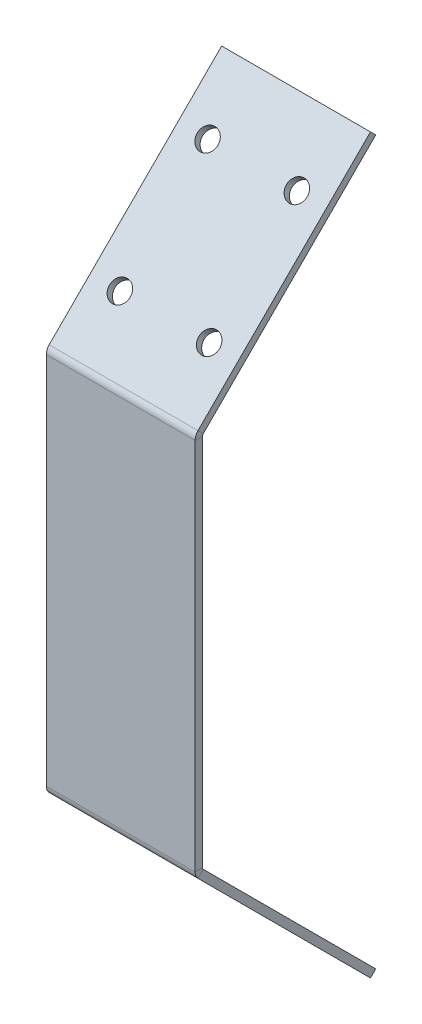
ISO-10303-21;
HEADER;
FILE_DESCRIPTION(('STEP AP214'),'2;1');
FILE_NAME('part.step','',(''),(''),'','','');
FILE_SCHEMA(('AUTOMOTIVE_DESIGN { 1 0 10303 214 1 1 1 1 }'));
ENDSEC;
DATA;
#1=APPLICATION_CONTEXT('core data for automotive mechanical design processes');
#2=APPLICATION_PROTOCOL_DEFINITION('international standard','automotive_design',2000,#1);
#3=PRODUCT_CONTEXT('',#1,'mechanical');
#4=PRODUCT('Part','Part','',(#3));
#5=PRODUCT_RELATED_PRODUCT_CATEGORY('part','',(#4));
#6=PRODUCT_DEFINITION_FORMATION('','',#4);
#7=PRODUCT_DEFINITION_CONTEXT('part definition',#1,'design');
#8=PRODUCT_DEFINITION('design','',#6,#7);
#9=PRODUCT_DEFINITION_SHAPE('','',#8);
#10=(LENGTH_UNIT() NAMED_UNIT(*) SI_UNIT(.MILLI.,.METRE.));
#11=(NAMED_UNIT(*) PLANE_ANGLE_UNIT() SI_UNIT($,.RADIAN.));
#12=(NAMED_UNIT(*) SI_UNIT($,.STERADIAN.) SOLID_ANGLE_UNIT());
#13=UNCERTAINTY_MEASURE_WITH_UNIT(LENGTH_MEASURE(1.E-05),#10,'distance_accuracy_value','');
#14=(GEOMETRIC_REPRESENTATION_CONTEXT(3) GLOBAL_UNCERTAINTY_ASSIGNED_CONTEXT((#13)) GLOBAL_UNIT_ASSIGNED_CONTEXT((#10,
#11,#12)) REPRESENTATION_CONTEXT('',''));
#15=CARTESIAN_POINT('',(0.,0.,0.));
#16=DIRECTION('',(0.,0.,1.));
#17=DIRECTION('',(1.,0.,0.));
#18=AXIS2_PLACEMENT_3D('',#15,#16,#17);
#19=CARTESIAN_POINT('',(0.,0.,-3.));
#20=DIRECTION('',(0.,0.,1.));
#21=DIRECTION('',(1.,0.,0.));
#22=AXIS2_PLACEMENT_3D('',#19,#20,#21);
#23=PLANE('',#22);
#24=DIRECTION('',(-1.,0.,0.));
#25=VECTOR('',#24,1.);
#26=CARTESIAN_POINT('',(-30.,-75.3431457505076,-2.99999999999998));
#27=LINE('',#26,#25);
#28=CARTESIAN_POINT('',(-30.,-75.3431457505076,-2.99999999999998));
#29=VERTEX_POINT('',#28);
#30=CARTESIAN_POINT('',(30.,-75.3431457505076,-2.99999999999998));
#31=VERTEX_POINT('',#30);
#32=EDGE_CURVE('E278',#29,#31,#27,.F.);
#33=ORIENTED_EDGE('',*,*,#32,.F.);
#34=DIRECTION('',(0.,-1.,0.));
#35=VECTOR('',#34,1.);
#36=CARTESIAN_POINT('',(-30.,80.,-3.));
#37=LINE('',#36,#35);
#38=CARTESIAN_POINT('',(-30.,75.3431457505076,-2.99999999999999));
#39=VERTEX_POINT('',#38);
#40=EDGE_CURVE('E13',#39,#29,#37,.T.);
#41=ORIENTED_EDGE('',*,*,#40,.F.);
#42=DIRECTION('',(1.,0.,0.));
#43=VECTOR('',#42,1.);
#44=CARTESIAN_POINT('',(30.,75.3431457505076,-2.99999999999999));
#45=LINE('',#44,#43);
#46=CARTESIAN_POINT('',(30.,75.3431457505076,-2.99999999999999));
#47=VERTEX_POINT('',#46);
#48=EDGE_CURVE('E145',#47,#39,#45,.F.);
#49=ORIENTED_EDGE('',*,*,#48,.F.);
#50=DIRECTION('',(0.,1.,0.));
#51=VECTOR('',#50,1.);
#52=CARTESIAN_POINT('',(30.,80.,-3.));
#53=LINE('',#52,#51);
#54=EDGE_CURVE('E86',#31,#47,#53,.T.);
#55=ORIENTED_EDGE('',*,*,#54,.F.);
#56=EDGE_LOOP('',(#33,#41,#49,#55));
#57=FACE_BOUND('',#56,.T.);
#58=ADVANCED_FACE('F77',(#57),#23,.F.);
#59=CARTESIAN_POINT('',(0.,0.,0.));
#60=DIRECTION('',(0.,0.,1.));
#61=DIRECTION('',(1.,0.,0.));
#62=AXIS2_PLACEMENT_3D('',#59,#60,#61);
#63=PLANE('',#62);
#64=DIRECTION('',(0.,-1.,0.));
#65=VECTOR('',#64,1.);
#66=CARTESIAN_POINT('',(-30.,80.,0.));
#67=LINE('',#66,#65);
#68=CARTESIAN_POINT('',(-30.,75.3431457505076,0.));
#69=VERTEX_POINT('',#68);
#70=CARTESIAN_POINT('',(-30.,-75.3431457505076,0.));
#71=VERTEX_POINT('',#70);
#72=EDGE_CURVE('E182',#69,#71,#67,.T.);
#73=ORIENTED_EDGE('',*,*,#72,.T.);
#74=DIRECTION('',(-1.,0.,0.));
#75=VECTOR('',#74,1.);
#76=CARTESIAN_POINT('',(-30.,-75.3431457505076,0.));
#77=LINE('',#76,#75);
#78=CARTESIAN_POINT('',(30.,-75.3431457505076,0.));
#79=VERTEX_POINT('',#78);
#80=EDGE_CURVE('E266',#71,#79,#77,.F.);
#81=ORIENTED_EDGE('',*,*,#80,.T.);
#82=DIRECTION('',(0.,1.,0.));
#83=VECTOR('',#82,1.);
#84=CARTESIAN_POINT('',(30.,80.,0.));
#85=LINE('',#84,#83);
#86=CARTESIAN_POINT('',(30.,75.3431457505076,0.));
#87=VERTEX_POINT('',#86);
#88=EDGE_CURVE('E103',#79,#87,#85,.T.);
#89=ORIENTED_EDGE('',*,*,#88,.T.);
#90=DIRECTION('',(1.,0.,0.));
#91=VECTOR('',#90,1.);
#92=CARTESIAN_POINT('',(30.,75.3431457505076,0.));
#93=LINE('',#92,#91);
#94=EDGE_CURVE('E172',#87,#69,#93,.F.);
#95=ORIENTED_EDGE('',*,*,#94,.T.);
#96=EDGE_LOOP('',(#73,#81,#89,#95));
#97=FACE_BOUND('',#96,.T.);
#98=ADVANCED_FACE('F375',(#97),#63,.T.);
#99=CARTESIAN_POINT('',(-30.,80.,-3.));
#100=DIRECTION('',(-1.,0.,0.));
#101=DIRECTION('',(0.,-1.,0.));
#102=AXIS2_PLACEMENT_3D('',#99,#100,#101);
#103=PLANE('',#102);
#104=ORIENTED_EDGE('',*,*,#40,.T.);
#105=DIRECTION('',(0.,0.,1.));
#106=VECTOR('',#105,1.);
#107=CARTESIAN_POINT('',(-30.,-75.3431457505076,-2.99999999999998));
#108=LINE('',#107,#106);
#109=EDGE_CURVE('E272',#29,#71,#108,.T.);
#110=ORIENTED_EDGE('',*,*,#109,.T.);
#111=ORIENTED_EDGE('',*,*,#72,.F.);
#112=DIRECTION('',(0.,0.,1.));
#113=VECTOR('',#112,1.);
#114=CARTESIAN_POINT('',(-30.,75.3431457505076,-2.99999999999999));
#115=LINE('',#114,#113);
#116=EDGE_CURVE('E179',#39,#69,#115,.T.);
#117=ORIENTED_EDGE('',*,*,#116,.F.);
#118=EDGE_LOOP('',(#104,#110,#111,#117));
#119=FACE_BOUND('',#118,.T.);
#120=ADVANCED_FACE('F385',(#119),#103,.T.);
#121=CARTESIAN_POINT('',(30.,80.,-3.));
#122=DIRECTION('',(1.,0.,0.));
#123=DIRECTION('',(0.,1.,0.));
#124=AXIS2_PLACEMENT_3D('',#121,#122,#123);
#125=PLANE('',#124);
#126=DIRECTION('',(0.,0.,1.));
#127=VECTOR('',#126,1.);
#128=CARTESIAN_POINT('',(30.,-75.3431457505076,-2.99999999999998));
#129=LINE('',#128,#127);
#130=EDGE_CURVE('E171',#31,#79,#129,.T.);
#131=ORIENTED_EDGE('',*,*,#130,.F.);
#132=ORIENTED_EDGE('',*,*,#54,.T.);
#133=DIRECTION('',(0.,0.,1.));
#134=VECTOR('',#133,1.);
#135=CARTESIAN_POINT('',(30.,75.3431457505076,-2.99999999999999));
#136=LINE('',#135,#134);
#137=EDGE_CURVE('E144',#47,#87,#136,.T.);
#138=ORIENTED_EDGE('',*,*,#137,.T.);
#139=ORIENTED_EDGE('',*,*,#88,.F.);
#140=EDGE_LOOP('',(#131,#132,#138,#139));
#141=FACE_BOUND('',#140,.T.);
#142=ADVANCED_FACE('F79',(#141),#125,.T.);
#143=CARTESIAN_POINT('',(-30.,75.3431457505076,-3.99999999999998));
#144=DIRECTION('',(-1.,0.,0.));
#145=DIRECTION('',(0.,0.,1.));
#146=AXIS2_PLACEMENT_3D('',#143,#144,#145);
#147=PLANE('',#146);
#148=DIRECTION('',(0.,0.707106781186544,0.707106781186551));
#149=VECTOR('',#148,1.);
#150=CARTESIAN_POINT('',(-30.,78.1715728752538,-1.1715728752538));
#151=LINE('',#150,#149);
#152=CARTESIAN_POINT('',(-30.,76.0502525316941,-3.29289321881344));
#153=VERTEX_POINT('',#152);
#154=CARTESIAN_POINT('',(-30.,78.1715728752538,-1.17157287525379));
#155=VERTEX_POINT('',#154);
#156=EDGE_CURVE('E134',#153,#155,#151,.T.);
#157=ORIENTED_EDGE('',*,*,#156,.F.);
#158=CARTESIAN_POINT('',(-30.,75.3431457505076,-3.99999999999998));
#159=DIRECTION('',(1.,0.,0.));
#160=DIRECTION('',(0.,0.,-1.));
#161=AXIS2_PLACEMENT_3D('',#158,#159,#160);
#162=CIRCLE('',#161,0.999999999999996);
#163=EDGE_CURVE('E128',#39,#153,#162,.F.);
#164=ORIENTED_EDGE('',*,*,#163,.F.);
#165=ORIENTED_EDGE('',*,*,#116,.T.);
#166=CARTESIAN_POINT('',(-30.,75.3431457505076,-3.99999999999998));
#167=DIRECTION('',(1.,0.,0.));
#168=DIRECTION('',(0.,0.,-1.));
#169=AXIS2_PLACEMENT_3D('',#166,#167,#168);
#170=CIRCLE('',#169,4.);
#171=EDGE_CURVE('E94',#69,#155,#170,.F.);
#172=ORIENTED_EDGE('',*,*,#171,.T.);
#173=EDGE_LOOP('',(#157,#164,#165,#172));
#174=FACE_BOUND('',#173,.T.);
#175=ADVANCED_FACE('F383',(#174),#147,.T.);
#176=CARTESIAN_POINT('',(30.,75.3431457505076,-3.99999999999998));
#177=DIRECTION('',(-1.,0.,0.));
#178=DIRECTION('',(0.,0.,1.));
#179=AXIS2_PLACEMENT_3D('',#176,#177,#178);
#180=PLANE('',#179);
#181=CARTESIAN_POINT('',(30.,75.3431457505076,-3.99999999999998));
#182=DIRECTION('',(1.,0.,0.));
#183=DIRECTION('',(0.,0.,-1.));
#184=AXIS2_PLACEMENT_3D('',#181,#182,#183);
#185=CIRCLE('',#184,0.999999999999996);
#186=CARTESIAN_POINT('',(30.,76.0502525316941,-3.29289321881344));
#187=VERTEX_POINT('',#186);
#188=EDGE_CURVE('E125',#187,#47,#185,.T.);
#189=ORIENTED_EDGE('',*,*,#188,.F.);
#190=DIRECTION('',(0.,0.707106781186544,0.707106781186551));
#191=VECTOR('',#190,1.);
#192=CARTESIAN_POINT('',(30.,76.0502525316941,-3.29289321881344));
#193=LINE('',#192,#191);
#194=CARTESIAN_POINT('',(30.,78.1715728752538,-1.17157287525378));
#195=VERTEX_POINT('',#194);
#196=EDGE_CURVE('E133',#187,#195,#193,.T.);
#197=ORIENTED_EDGE('',*,*,#196,.T.);
#198=CARTESIAN_POINT('',(30.,75.3431457505076,-3.99999999999998));
#199=DIRECTION('',(1.,0.,0.));
#200=DIRECTION('',(0.,0.,-1.));
#201=AXIS2_PLACEMENT_3D('',#198,#199,#200);
#202=CIRCLE('',#201,4.);
#203=EDGE_CURVE('E174',#195,#87,#202,.T.);
#204=ORIENTED_EDGE('',*,*,#203,.T.);
#205=ORIENTED_EDGE('',*,*,#137,.F.);
#206=EDGE_LOOP('',(#189,#197,#204,#205));
#207=FACE_BOUND('',#206,.T.);
#208=ADVANCED_FACE('F139',(#207),#180,.F.);
#209=CARTESIAN_POINT('',(30.,75.3431457505076,-3.99999999999998));
#210=DIRECTION('',(1.,0.,0.));
#211=DIRECTION('',(0.,0.707106781186544,0.707106781186551));
#212=AXIS2_PLACEMENT_3D('',#209,#210,#211);
#213=CYLINDRICAL_SURFACE('',#212,4.);
#214=ORIENTED_EDGE('',*,*,#94,.F.);
#215=ORIENTED_EDGE('',*,*,#203,.F.);
#216=DIRECTION('',(1.,0.,0.));
#217=VECTOR('',#216,1.);
#218=CARTESIAN_POINT('',(0.,78.1715728752538,-1.17157287525377));
#219=LINE('',#218,#217);
#220=EDGE_CURVE('E163',#155,#195,#219,.T.);
#221=ORIENTED_EDGE('',*,*,#220,.F.);
#222=ORIENTED_EDGE('',*,*,#171,.F.);
#223=EDGE_LOOP('',(#214,#215,#221,#222));
#224=FACE_BOUND('',#223,.T.);
#225=ADVANCED_FACE('F399',(#224),#213,.T.);
#226=CARTESIAN_POINT('',(30.,75.3431457505076,-3.99999999999998));
#227=DIRECTION('',(1.,0.,0.));
#228=DIRECTION('',(0.,0.707106781186544,0.707106781186551));
#229=AXIS2_PLACEMENT_3D('',#226,#227,#228);
#230=CYLINDRICAL_SURFACE('',#229,0.999999999999996);
#231=ORIENTED_EDGE('',*,*,#48,.T.);
#232=ORIENTED_EDGE('',*,*,#163,.T.);
#233=DIRECTION('',(-1.,0.,0.));
#234=VECTOR('',#233,1.);
#235=CARTESIAN_POINT('',(-30.,76.0502525316941,-3.29289321881344));
#236=LINE('',#235,#234);
#237=EDGE_CURVE('E122',#153,#187,#236,.F.);
#238=ORIENTED_EDGE('',*,*,#237,.T.);
#239=ORIENTED_EDGE('',*,*,#188,.T.);
#240=EDGE_LOOP('',(#231,#232,#238,#239));
#241=FACE_BOUND('',#240,.T.);
#242=ADVANCED_FACE('F124',(#241),#230,.F.);
#243=CARTESIAN_POINT('',(30.,77.8786796564403,-0.878679656440342));
#244=DIRECTION('',(1.,0.,0.));
#245=DIRECTION('',(0.,1.,0.));
#246=AXIS2_PLACEMENT_3D('',#243,#244,#245);
#247=PLANE('',#246);
#248=DIRECTION('',(0.,-0.707106781186551,0.707106781186544));
#249=VECTOR('',#248,1.);
#250=CARTESIAN_POINT('',(30.,77.8786796564403,-0.878679656440342));
#251=LINE('',#250,#249);
#252=CARTESIAN_POINT('',(30.,147.710678118655,-70.7106781186544));
#253=VERTEX_POINT('',#252);
#254=EDGE_CURVE('E162',#253,#195,#251,.T.);
#255=ORIENTED_EDGE('',*,*,#254,.T.);
#256=ORIENTED_EDGE('',*,*,#196,.F.);
#257=DIRECTION('',(0.,0.707106781186551,-0.707106781186544));
#258=VECTOR('',#257,1.);
#259=CARTESIAN_POINT('',(30.,34.2573593128803,38.5));
#260=LINE('',#259,#258);
#261=CARTESIAN_POINT('',(30.,145.589357775095,-72.8319984622141));
#262=VERTEX_POINT('',#261);
#263=EDGE_CURVE('E150',#262,#187,#260,.F.);
#264=ORIENTED_EDGE('',*,*,#263,.F.);
#265=DIRECTION('',(0.,-0.707106781186544,-0.707106781186551));
#266=VECTOR('',#265,1.);
#267=CARTESIAN_POINT('',(30.,147.710678118655,-70.7106781186544));
#268=LINE('',#267,#266);
#269=EDGE_CURVE('E146',#253,#262,#268,.T.);
#270=ORIENTED_EDGE('',*,*,#269,.F.);
#271=EDGE_LOOP('',(#255,#256,#264,#270));
#272=FACE_BOUND('',#271,.T.);
#273=ADVANCED_FACE('F160',(#272),#247,.T.);
#274=CARTESIAN_POINT('',(-30.,147.710678118655,-70.7106781186544));
#275=DIRECTION('',(-1.,0.,0.));
#276=DIRECTION('',(0.,-1.,0.));
#277=AXIS2_PLACEMENT_3D('',#274,#275,#276);
#278=PLANE('',#277);
#279=DIRECTION('',(0.,-0.707106781186551,0.707106781186544));
#280=VECTOR('',#279,1.);
#281=CARTESIAN_POINT('',(-30.,34.2573593128803,38.5));
#282=LINE('',#281,#280);
#283=CARTESIAN_POINT('',(-30.,145.589357775095,-72.8319984622141));
#284=VERTEX_POINT('',#283);
#285=EDGE_CURVE('E165',#153,#284,#282,.F.);
#286=ORIENTED_EDGE('',*,*,#285,.F.);
#287=ORIENTED_EDGE('',*,*,#156,.T.);
#288=DIRECTION('',(0.,0.707106781186551,-0.707106781186544));
#289=VECTOR('',#288,1.);
#290=CARTESIAN_POINT('',(-30.,147.710678118655,-70.7106781186544));
#291=LINE('',#290,#289);
#292=CARTESIAN_POINT('',(-30.,147.710678118655,-70.7106781186544));
#293=VERTEX_POINT('',#292);
#294=EDGE_CURVE('E157',#155,#293,#291,.T.);
#295=ORIENTED_EDGE('',*,*,#294,.T.);
#296=DIRECTION('',(0.,-0.707106781186544,-0.707106781186551));
#297=VECTOR('',#296,1.);
#298=CARTESIAN_POINT('',(-30.,147.710678118655,-70.7106781186544));
#299=LINE('',#298,#297);
#300=EDGE_CURVE('E289',#293,#284,#299,.T.);
#301=ORIENTED_EDGE('',*,*,#300,.T.);
#302=EDGE_LOOP('',(#286,#287,#295,#301));
#303=FACE_BOUND('',#302,.T.);
#304=ADVANCED_FACE('F302',(#303),#278,.T.);
#305=CARTESIAN_POINT('',(0.,36.3786796564399,40.6213203435596));
#306=DIRECTION('',(0.,0.707106781186544,0.707106781186551));
#307=DIRECTION('',(0.,-0.707106781186551,0.707106781186544));
#308=AXIS2_PLACEMENT_3D('',#305,#306,#307);
#309=PLANE('',#308);
#310=CARTESIAN_POINT('',(-18.,94.6776695296638,-17.6776695296636));
#311=DIRECTION('',(0.,0.707106781186544,0.707106781186551));
#312=DIRECTION('',(0.,-0.707106781186551,0.707106781186544));
#313=AXIS2_PLACEMENT_3D('',#310,#311,#312);
#314=CIRCLE('',#313,4.19999999999999);
#315=CARTESIAN_POINT('',(-18.,91.7078210486803,-14.7078210486801));
#316=VERTEX_POINT('',#315);
#317=EDGE_CURVE('E485',#316,#316,#314,.T.);
#318=ORIENTED_EDGE('',*,*,#317,.F.);
#319=EDGE_LOOP('',(#318));
#320=FACE_BOUND('',#319,.T.);
#321=CARTESIAN_POINT('',(18.,94.6776695296638,-17.6776695296636));
#322=DIRECTION('',(0.,0.707106781186544,0.707106781186551));
#323=DIRECTION('',(0.,-0.707106781186551,0.707106781186544));
#324=AXIS2_PLACEMENT_3D('',#321,#322,#323);
#325=CIRCLE('',#324,4.19999999999999);
#326=CARTESIAN_POINT('',(18.,91.7078210486803,-14.7078210486801));
#327=VERTEX_POINT('',#326);
#328=EDGE_CURVE('E481',#327,#327,#325,.T.);
#329=ORIENTED_EDGE('',*,*,#328,.F.);
#330=EDGE_LOOP('',(#329));
#331=FACE_BOUND('',#330,.T.);
#332=CARTESIAN_POINT('',(18.,130.033008588991,-53.0330085889908));
#333=DIRECTION('',(0.,0.707106781186544,0.707106781186551));
#334=DIRECTION('',(0.,-0.707106781186551,0.707106781186544));
#335=AXIS2_PLACEMENT_3D('',#332,#333,#334);
#336=CIRCLE('',#335,4.2);
#337=CARTESIAN_POINT('',(18.,127.063160108008,-50.0631601080073));
#338=VERTEX_POINT('',#337);
#339=EDGE_CURVE('E474',#338,#338,#336,.T.);
#340=ORIENTED_EDGE('',*,*,#339,.F.);
#341=EDGE_LOOP('',(#340));
#342=FACE_BOUND('',#341,.T.);
#343=CARTESIAN_POINT('',(-18.,130.033008588991,-53.0330085889908));
#344=DIRECTION('',(0.,0.707106781186544,0.707106781186551));
#345=DIRECTION('',(0.,-0.707106781186551,0.707106781186544));
#346=AXIS2_PLACEMENT_3D('',#343,#344,#345);
#347=CIRCLE('',#346,4.20000000000001);
#348=CARTESIAN_POINT('',(-18.,127.063160108008,-50.0631601080073));
#349=VERTEX_POINT('',#348);
#350=EDGE_CURVE('E205',#349,#349,#347,.T.);
#351=ORIENTED_EDGE('',*,*,#350,.F.);
#352=EDGE_LOOP('',(#351));
#353=FACE_BOUND('',#352,.T.);
#354=ORIENTED_EDGE('',*,*,#294,.F.);
#355=ORIENTED_EDGE('',*,*,#220,.T.);
#356=ORIENTED_EDGE('',*,*,#254,.F.);
#357=DIRECTION('',(1.,0.,0.));
#358=VECTOR('',#357,1.);
#359=CARTESIAN_POINT('',(30.,147.710678118655,-70.7106781186544));
#360=LINE('',#359,#358);
#361=EDGE_CURVE('E293',#293,#253,#360,.T.);
#362=ORIENTED_EDGE('',*,*,#361,.F.);
#363=EDGE_LOOP('',(#354,#355,#356,#362));
#364=FACE_BOUND('',#363,.T.);
#365=ADVANCED_FACE('F408',(#320,#331,#342,#353,#364),#309,.T.);
#366=CARTESIAN_POINT('',(0.,34.2573593128803,38.5));
#367=DIRECTION('',(0.,0.707106781186544,0.707106781186551));
#368=DIRECTION('',(0.,-0.707106781186551,0.707106781186544));
#369=AXIS2_PLACEMENT_3D('',#366,#367,#368);
#370=PLANE('',#369);
#371=CARTESIAN_POINT('',(-18.,92.5563491861041,-19.7989898732233));
#372=DIRECTION('',(0.,0.707106781186544,0.707106781186551));
#373=DIRECTION('',(0.,-0.707106781186551,0.707106781186544));
#374=AXIS2_PLACEMENT_3D('',#371,#372,#373);
#375=CIRCLE('',#374,4.19999999999999);
#376=CARTESIAN_POINT('',(-18.,89.5865007051206,-16.8291413922398));
#377=VERTEX_POINT('',#376);
#378=EDGE_CURVE('E81',#377,#377,#375,.T.);
#379=ORIENTED_EDGE('',*,*,#378,.T.);
#380=EDGE_LOOP('',(#379));
#381=FACE_BOUND('',#380,.T.);
#382=CARTESIAN_POINT('',(18.,92.5563491861041,-19.7989898732233));
#383=DIRECTION('',(0.,0.707106781186544,0.707106781186551));
#384=DIRECTION('',(0.,-0.707106781186551,0.707106781186544));
#385=AXIS2_PLACEMENT_3D('',#382,#383,#384);
#386=CIRCLE('',#385,4.19999999999999);
#387=CARTESIAN_POINT('',(18.,89.5865007051206,-16.8291413922398));
#388=VERTEX_POINT('',#387);
#389=EDGE_CURVE('E207',#388,#388,#386,.T.);
#390=ORIENTED_EDGE('',*,*,#389,.T.);
#391=EDGE_LOOP('',(#390));
#392=FACE_BOUND('',#391,.T.);
#393=CARTESIAN_POINT('',(18.,127.911688245432,-55.1543289325505));
#394=DIRECTION('',(0.,0.707106781186544,0.707106781186551));
#395=DIRECTION('',(0.,-0.707106781186551,0.707106781186544));
#396=AXIS2_PLACEMENT_3D('',#393,#394,#395);
#397=CIRCLE('',#396,4.2);
#398=CARTESIAN_POINT('',(18.,124.941839764448,-52.184480451567));
#399=VERTEX_POINT('',#398);
#400=EDGE_CURVE('E204',#399,#399,#397,.T.);
#401=ORIENTED_EDGE('',*,*,#400,.T.);
#402=EDGE_LOOP('',(#401));
#403=FACE_BOUND('',#402,.T.);
#404=CARTESIAN_POINT('',(-18.,127.911688245432,-55.1543289325505));
#405=DIRECTION('',(0.,0.707106781186544,0.707106781186551));
#406=DIRECTION('',(0.,-0.707106781186551,0.707106781186544));
#407=AXIS2_PLACEMENT_3D('',#404,#405,#406);
#408=CIRCLE('',#407,4.20000000000001);
#409=CARTESIAN_POINT('',(-18.,124.941839764448,-52.184480451567));
#410=VERTEX_POINT('',#409);
#411=EDGE_CURVE('E201',#410,#410,#408,.T.);
#412=ORIENTED_EDGE('',*,*,#411,.T.);
#413=EDGE_LOOP('',(#412));
#414=FACE_BOUND('',#413,.T.);
#415=ORIENTED_EDGE('',*,*,#237,.F.);
#416=ORIENTED_EDGE('',*,*,#285,.T.);
#417=DIRECTION('',(-1.,0.,0.));
#418=VECTOR('',#417,1.);
#419=CARTESIAN_POINT('',(0.,145.589357775095,-72.8319984622141));
#420=LINE('',#419,#418);
#421=EDGE_CURVE('E154',#284,#262,#420,.F.);
#422=ORIENTED_EDGE('',*,*,#421,.T.);
#423=ORIENTED_EDGE('',*,*,#263,.T.);
#424=EDGE_LOOP('',(#415,#416,#422,#423));
#425=FACE_BOUND('',#424,.T.);
#426=ADVANCED_FACE('F151',(#381,#392,#403,#414,#425),#370,.F.);
#427=CARTESIAN_POINT('',(30.,147.710678118655,-70.7106781186544));
#428=DIRECTION('',(0.,0.707106781186551,-0.707106781186544));
#429=DIRECTION('',(0.,0.707106781186544,0.707106781186551));
#430=AXIS2_PLACEMENT_3D('',#427,#428,#429);
#431=PLANE('',#430);
#432=ORIENTED_EDGE('',*,*,#421,.F.);
#433=ORIENTED_EDGE('',*,*,#300,.F.);
#434=ORIENTED_EDGE('',*,*,#361,.T.);
#435=ORIENTED_EDGE('',*,*,#269,.T.);
#436=EDGE_LOOP('',(#432,#433,#434,#435));
#437=FACE_BOUND('',#436,.T.);
#438=ADVANCED_FACE('F307',(#437),#431,.T.);
#439=CARTESIAN_POINT('',(30.,-75.3431457505076,-4.));
#440=DIRECTION('',(1.,0.,0.));
#441=DIRECTION('',(0.,0.,-1.));
#442=AXIS2_PLACEMENT_3D('',#439,#440,#441);
#443=PLANE('',#442);
#444=DIRECTION('',(0.,0.707106781186544,-0.707106781186551));
#445=VECTOR('',#444,1.);
#446=CARTESIAN_POINT('',(30.,-78.1715728752538,-1.17157287525379));
#447=LINE('',#446,#445);
#448=CARTESIAN_POINT('',(30.,-76.0502525316942,-3.29289321881344));
#449=VERTEX_POINT('',#448);
#450=CARTESIAN_POINT('',(30.,-78.1715728752538,-1.17157287525379));
#451=VERTEX_POINT('',#450);
#452=EDGE_CURVE('E200',#449,#451,#447,.F.);
#453=ORIENTED_EDGE('',*,*,#452,.F.);
#454=CARTESIAN_POINT('',(30.,-75.3431457505076,-4.));
#455=DIRECTION('',(-1.,0.,0.));
#456=DIRECTION('',(0.,0.,1.));
#457=AXIS2_PLACEMENT_3D('',#454,#455,#456);
#458=CIRCLE('',#457,1.00000000000001);
#459=EDGE_CURVE('E275',#31,#449,#458,.F.);
#460=ORIENTED_EDGE('',*,*,#459,.F.);
#461=ORIENTED_EDGE('',*,*,#130,.T.);
#462=CARTESIAN_POINT('',(30.,-75.3431457505076,-4.));
#463=DIRECTION('',(-1.,0.,0.));
#464=DIRECTION('',(0.,0.,1.));
#465=AXIS2_PLACEMENT_3D('',#462,#463,#464);
#466=CIRCLE('',#465,4.00000000000001);
#467=EDGE_CURVE('E268',#79,#451,#466,.F.);
#468=ORIENTED_EDGE('',*,*,#467,.T.);
#469=EDGE_LOOP('',(#453,#460,#461,#468));
#470=FACE_BOUND('',#469,.T.);
#471=ADVANCED_FACE('F358',(#470),#443,.T.);
#472=CARTESIAN_POINT('',(-30.,-75.3431457505076,-4.));
#473=DIRECTION('',(1.,0.,0.));
#474=DIRECTION('',(0.,0.,-1.));
#475=AXIS2_PLACEMENT_3D('',#472,#473,#474);
#476=PLANE('',#475);
#477=CARTESIAN_POINT('',(-30.,-75.3431457505076,-4.));
#478=DIRECTION('',(-1.,0.,0.));
#479=DIRECTION('',(0.,0.,1.));
#480=AXIS2_PLACEMENT_3D('',#477,#478,#479);
#481=CIRCLE('',#480,1.00000000000001);
#482=CARTESIAN_POINT('',(-30.,-76.0502525316942,-3.29289321881344));
#483=VERTEX_POINT('',#482);
#484=EDGE_CURVE('E233',#483,#29,#481,.T.);
#485=ORIENTED_EDGE('',*,*,#484,.F.);
#486=DIRECTION('',(0.,0.707106781186544,-0.707106781186551));
#487=VECTOR('',#486,1.);
#488=CARTESIAN_POINT('',(-30.,-76.0502525316942,-3.29289321881344));
#489=LINE('',#488,#487);
#490=CARTESIAN_POINT('',(-30.,-78.1715728752538,-1.17157287525378));
#491=VERTEX_POINT('',#490);
#492=EDGE_CURVE('E258',#483,#491,#489,.F.);
#493=ORIENTED_EDGE('',*,*,#492,.T.);
#494=CARTESIAN_POINT('',(-30.,-75.3431457505076,-4.));
#495=DIRECTION('',(-1.,0.,0.));
#496=DIRECTION('',(0.,0.,1.));
#497=AXIS2_PLACEMENT_3D('',#494,#495,#496);
#498=CIRCLE('',#497,4.00000000000001);
#499=EDGE_CURVE('E269',#491,#71,#498,.T.);
#500=ORIENTED_EDGE('',*,*,#499,.T.);
#501=ORIENTED_EDGE('',*,*,#109,.F.);
#502=EDGE_LOOP('',(#485,#493,#500,#501));
#503=FACE_BOUND('',#502,.T.);
#504=ADVANCED_FACE('F372',(#503),#476,.F.);
#505=CARTESIAN_POINT('',(-30.,-75.3431457505076,-4.));
#506=DIRECTION('',(-1.,0.,0.));
#507=DIRECTION('',(0.,-0.707106781186544,0.707106781186551));
#508=AXIS2_PLACEMENT_3D('',#505,#506,#507);
#509=CYLINDRICAL_SURFACE('',#508,4.00000000000001);
#510=ORIENTED_EDGE('',*,*,#80,.F.);
#511=ORIENTED_EDGE('',*,*,#499,.F.);
#512=DIRECTION('',(-1.,0.,0.));
#513=VECTOR('',#512,1.);
#514=CARTESIAN_POINT('',(30.,-78.1715728752538,-1.17157287525378));
#515=LINE('',#514,#513);
#516=EDGE_CURVE('E255',#491,#451,#515,.F.);
#517=ORIENTED_EDGE('',*,*,#516,.T.);
#518=ORIENTED_EDGE('',*,*,#467,.F.);
#519=EDGE_LOOP('',(#510,#511,#517,#518));
#520=FACE_BOUND('',#519,.T.);
#521=ADVANCED_FACE('F374',(#520),#509,.T.);
#522=CARTESIAN_POINT('',(-30.,-75.3431457505076,-4.));
#523=DIRECTION('',(-1.,0.,0.));
#524=DIRECTION('',(0.,-0.707106781186544,0.707106781186551));
#525=AXIS2_PLACEMENT_3D('',#522,#523,#524);
#526=CYLINDRICAL_SURFACE('',#525,1.00000000000001);
#527=ORIENTED_EDGE('',*,*,#32,.T.);
#528=ORIENTED_EDGE('',*,*,#459,.T.);
#529=DIRECTION('',(-1.,0.,0.));
#530=VECTOR('',#529,1.);
#531=CARTESIAN_POINT('',(30.,-76.0502525316942,-3.29289321881344));
#532=LINE('',#531,#530);
#533=EDGE_CURVE('E261',#449,#483,#532,.T.);
#534=ORIENTED_EDGE('',*,*,#533,.T.);
#535=ORIENTED_EDGE('',*,*,#484,.T.);
#536=EDGE_LOOP('',(#527,#528,#534,#535));
#537=FACE_BOUND('',#536,.T.);
#538=ADVANCED_FACE('F362',(#537),#526,.F.);
#539=CARTESIAN_POINT('',(-30.,-147.710678118655,-70.7106781186544));
#540=DIRECTION('',(1.,0.,0.));
#541=DIRECTION('',(0.,1.,0.));
#542=AXIS2_PLACEMENT_3D('',#539,#540,#541);
#543=PLANE('',#542);
#544=ORIENTED_EDGE('',*,*,#492,.F.);
#545=DIRECTION('',(0.,0.707106781186551,0.707106781186544));
#546=VECTOR('',#545,1.);
#547=CARTESIAN_POINT('',(-30.,-145.589357775095,-72.831998462214));
#548=LINE('',#547,#546);
#549=CARTESIAN_POINT('',(-30.,-145.589357775095,-72.831998462214));
#550=VERTEX_POINT('',#549);
#551=EDGE_CURVE('E252',#483,#550,#548,.F.);
#552=ORIENTED_EDGE('',*,*,#551,.T.);
#553=DIRECTION('',(0.,0.707106781186544,-0.707106781186551));
#554=VECTOR('',#553,1.);
#555=CARTESIAN_POINT('',(-30.,-147.710678118655,-70.7106781186544));
#556=LINE('',#555,#554);
#557=CARTESIAN_POINT('',(-30.,-147.710678118655,-70.7106781186543));
#558=VERTEX_POINT('',#557);
#559=EDGE_CURVE('E230',#558,#550,#556,.T.);
#560=ORIENTED_EDGE('',*,*,#559,.F.);
#561=DIRECTION('',(0.,-0.707106781186551,-0.707106781186544));
#562=VECTOR('',#561,1.);
#563=CARTESIAN_POINT('',(-30.,-36.3786796564399,40.6213203435597));
#564=LINE('',#563,#562);
#565=EDGE_CURVE('E243',#491,#558,#564,.T.);
#566=ORIENTED_EDGE('',*,*,#565,.F.);
#567=EDGE_LOOP('',(#544,#552,#560,#566));
#568=FACE_BOUND('',#567,.T.);
#569=ADVANCED_FACE('F370',(#568),#543,.F.);
#570=CARTESIAN_POINT('',(30.,-77.8786796564403,-0.878679656440342));
#571=DIRECTION('',(-1.,0.,0.));
#572=DIRECTION('',(0.,-1.,0.));
#573=AXIS2_PLACEMENT_3D('',#570,#571,#572);
#574=PLANE('',#573);
#575=ORIENTED_EDGE('',*,*,#452,.T.);
#576=DIRECTION('',(0.,0.707106781186551,0.707106781186544));
#577=VECTOR('',#576,1.);
#578=CARTESIAN_POINT('',(30.,-36.3786796564399,40.6213203435597));
#579=LINE('',#578,#577);
#580=CARTESIAN_POINT('',(30.,-147.710678118655,-70.7106781186543));
#581=VERTEX_POINT('',#580);
#582=EDGE_CURVE('E237',#581,#451,#579,.T.);
#583=ORIENTED_EDGE('',*,*,#582,.F.);
#584=DIRECTION('',(0.,0.707106781186544,-0.707106781186551));
#585=VECTOR('',#584,1.);
#586=CARTESIAN_POINT('',(30.,-147.710678118655,-70.7106781186544));
#587=LINE('',#586,#585);
#588=CARTESIAN_POINT('',(30.,-145.589357775096,-72.831998462214));
#589=VERTEX_POINT('',#588);
#590=EDGE_CURVE('E234',#581,#589,#587,.T.);
#591=ORIENTED_EDGE('',*,*,#590,.T.);
#592=DIRECTION('',(0.,-0.707106781186551,-0.707106781186544));
#593=VECTOR('',#592,1.);
#594=CARTESIAN_POINT('',(30.,-75.7573593128807,-2.99999999999998));
#595=LINE('',#594,#593);
#596=EDGE_CURVE('E246',#589,#449,#595,.F.);
#597=ORIENTED_EDGE('',*,*,#596,.T.);
#598=EDGE_LOOP('',(#575,#583,#591,#597));
#599=FACE_BOUND('',#598,.T.);
#600=ADVANCED_FACE('F355',(#599),#574,.F.);
#601=CARTESIAN_POINT('',(0.,-36.3786796564399,40.6213203435597));
#602=DIRECTION('',(0.,0.707106781186544,-0.707106781186551));
#603=DIRECTION('',(0.,0.707106781186551,0.707106781186544));
#604=AXIS2_PLACEMENT_3D('',#601,#602,#603);
#605=PLANE('',#604);
#606=CARTESIAN_POINT('',(17.9999999999944,-94.6776695296432,-17.677669529643));
#607=DIRECTION('',(0.,-0.707106781186544,0.707106781186551));
#608=DIRECTION('',(0.,-0.707106781186551,-0.707106781186544));
#609=AXIS2_PLACEMENT_3D('',#606,#607,#608);
#610=CIRCLE('',#609,4.19999999999632);
#611=CARTESIAN_POINT('',(17.9999999999944,-97.6475180106242,-20.6475180106239));
#612=VERTEX_POINT('',#611);
#613=EDGE_CURVE('E221',#612,#612,#610,.T.);
#614=ORIENTED_EDGE('',*,*,#613,.F.);
#615=EDGE_LOOP('',(#614));
#616=FACE_BOUND('',#615,.T.);
#617=CARTESIAN_POINT('',(-18.0000000000052,-130.033008588971,-53.0330085889704));
#618=DIRECTION('',(0.,-0.707106781186544,0.707106781186551));
#619=DIRECTION('',(0.,-0.707106781186551,-0.707106781186544));
#620=AXIS2_PLACEMENT_3D('',#617,#618,#619);
#621=CIRCLE('',#620,4.19999999999632);
#622=CARTESIAN_POINT('',(-18.0000000000052,-133.002857069952,-56.0028570699512));
#623=VERTEX_POINT('',#622);
#624=EDGE_CURVE('E216',#623,#623,#621,.T.);
#625=ORIENTED_EDGE('',*,*,#624,.F.);
#626=EDGE_LOOP('',(#625));
#627=FACE_BOUND('',#626,.T.);
#628=CARTESIAN_POINT('',(17.9999999999948,-130.033008588971,-53.0330085889702));
#629=DIRECTION('',(0.,-0.707106781186544,0.707106781186551));
#630=DIRECTION('',(0.,-0.707106781186551,-0.707106781186544));
#631=AXIS2_PLACEMENT_3D('',#628,#629,#630);
#632=CIRCLE('',#631,4.19999999999632);
#633=CARTESIAN_POINT('',(17.9999999999948,-133.002857069952,-56.0028570699511));
#634=VERTEX_POINT('',#633);
#635=EDGE_CURVE('E212',#634,#634,#632,.T.);
#636=ORIENTED_EDGE('',*,*,#635,.F.);
#637=EDGE_LOOP('',(#636));
#638=FACE_BOUND('',#637,.T.);
#639=CARTESIAN_POINT('',(-18.0000000000056,-94.6776695296434,-17.6776695296432));
#640=DIRECTION('',(0.,-0.707106781186544,0.707106781186551));
#641=DIRECTION('',(0.,-0.707106781186551,-0.707106781186544));
#642=AXIS2_PLACEMENT_3D('',#639,#640,#641);
#643=CIRCLE('',#642,4.19999999999998);
#644=CARTESIAN_POINT('',(-18.0000000000056,-97.6475180106269,-20.6475180106267));
#645=VERTEX_POINT('',#644);
#646=EDGE_CURVE('E191',#645,#645,#643,.T.);
#647=ORIENTED_EDGE('',*,*,#646,.F.);
#648=EDGE_LOOP('',(#647));
#649=FACE_BOUND('',#648,.T.);
#650=ORIENTED_EDGE('',*,*,#516,.F.);
#651=ORIENTED_EDGE('',*,*,#565,.T.);
#652=DIRECTION('',(1.,0.,0.));
#653=VECTOR('',#652,1.);
#654=CARTESIAN_POINT('',(0.,-147.710678118655,-70.7106781186543));
#655=LINE('',#654,#653);
#656=EDGE_CURVE('E240',#558,#581,#655,.T.);
#657=ORIENTED_EDGE('',*,*,#656,.T.);
#658=ORIENTED_EDGE('',*,*,#582,.T.);
#659=EDGE_LOOP('',(#650,#651,#657,#658));
#660=FACE_BOUND('',#659,.T.);
#661=ADVANCED_FACE('F346',(#616,#627,#638,#649,#660),#605,.F.);
#662=CARTESIAN_POINT('',(0.,-34.2573593128803,38.5));
#663=DIRECTION('',(0.,0.707106781186544,-0.707106781186551));
#664=DIRECTION('',(0.,0.707106781186551,0.707106781186544));
#665=AXIS2_PLACEMENT_3D('',#662,#663,#664);
#666=PLANE('',#665);
#667=CARTESIAN_POINT('',(17.9999999999944,-92.5563491860836,-19.7989898732027));
#668=DIRECTION('',(0.,0.707106781186544,-0.707106781186551));
#669=DIRECTION('',(0.,0.707106781186551,0.707106781186544));
#670=AXIS2_PLACEMENT_3D('',#667,#668,#669);
#671=CIRCLE('',#670,4.19999999999632);
#672=CARTESIAN_POINT('',(17.9999999999944,-89.5865007051027,-16.8291413922218));
#673=VERTEX_POINT('',#672);
#674=EDGE_CURVE('E197',#673,#673,#671,.T.);
#675=ORIENTED_EDGE('',*,*,#674,.F.);
#676=EDGE_LOOP('',(#675));
#677=FACE_BOUND('',#676,.T.);
#678=CARTESIAN_POINT('',(-18.0000000000052,-127.911688245411,-55.15432893253));
#679=DIRECTION('',(0.,0.707106781186544,-0.707106781186551));
#680=DIRECTION('',(0.,0.707106781186551,0.707106781186544));
#681=AXIS2_PLACEMENT_3D('',#678,#679,#680);
#682=CIRCLE('',#681,4.19999999999632);
#683=CARTESIAN_POINT('',(-18.0000000000052,-124.94183976443,-52.1844804515491));
#684=VERTEX_POINT('',#683);
#685=EDGE_CURVE('E194',#684,#684,#682,.T.);
#686=ORIENTED_EDGE('',*,*,#685,.F.);
#687=EDGE_LOOP('',(#686));
#688=FACE_BOUND('',#687,.T.);
#689=CARTESIAN_POINT('',(17.9999999999948,-127.911688245411,-55.1543289325299));
#690=DIRECTION('',(0.,0.707106781186544,-0.707106781186551));
#691=DIRECTION('',(0.,0.707106781186551,0.707106781186544));
#692=AXIS2_PLACEMENT_3D('',#689,#690,#691);
#693=CIRCLE('',#692,4.19999999999632);
#694=CARTESIAN_POINT('',(17.9999999999948,-124.94183976443,-52.184480451549));
#695=VERTEX_POINT('',#694);
#696=EDGE_CURVE('E190',#695,#695,#693,.T.);
#697=ORIENTED_EDGE('',*,*,#696,.F.);
#698=EDGE_LOOP('',(#697));
#699=FACE_BOUND('',#698,.T.);
#700=CARTESIAN_POINT('',(-18.0000000000056,-92.5563491860838,-19.7989898732028));
#701=DIRECTION('',(0.,0.707106781186544,-0.707106781186551));
#702=DIRECTION('',(0.,0.707106781186551,0.707106781186544));
#703=AXIS2_PLACEMENT_3D('',#700,#701,#702);
#704=CIRCLE('',#703,4.19999999999998);
#705=CARTESIAN_POINT('',(-18.0000000000056,-89.5865007051003,-16.8291413922194));
#706=VERTEX_POINT('',#705);
#707=EDGE_CURVE('E187',#706,#706,#704,.T.);
#708=ORIENTED_EDGE('',*,*,#707,.F.);
#709=EDGE_LOOP('',(#708));
#710=FACE_BOUND('',#709,.T.);
#711=ORIENTED_EDGE('',*,*,#551,.F.);
#712=ORIENTED_EDGE('',*,*,#533,.F.);
#713=ORIENTED_EDGE('',*,*,#596,.F.);
#714=DIRECTION('',(-1.,0.,0.));
#715=VECTOR('',#714,1.);
#716=CARTESIAN_POINT('',(30.,-145.589357775095,-72.831998462214));
#717=LINE('',#716,#715);
#718=EDGE_CURVE('E249',#550,#589,#717,.F.);
#719=ORIENTED_EDGE('',*,*,#718,.F.);
#720=EDGE_LOOP('',(#711,#712,#713,#719));
#721=FACE_BOUND('',#720,.T.);
#722=ADVANCED_FACE('F367',(#677,#688,#699,#710,#721),#666,.T.);
#723=CARTESIAN_POINT('',(30.,-147.710678118655,-70.7106781186544));
#724=DIRECTION('',(0.,0.707106781186551,0.707106781186544));
#725=DIRECTION('',(0.,-0.707106781186544,0.707106781186551));
#726=AXIS2_PLACEMENT_3D('',#723,#724,#725);
#727=PLANE('',#726);
#728=ORIENTED_EDGE('',*,*,#718,.T.);
#729=ORIENTED_EDGE('',*,*,#590,.F.);
#730=ORIENTED_EDGE('',*,*,#656,.F.);
#731=ORIENTED_EDGE('',*,*,#559,.T.);
#732=EDGE_LOOP('',(#728,#729,#730,#731));
#733=FACE_BOUND('',#732,.T.);
#734=ADVANCED_FACE('F351',(#733),#727,.F.);
#735=CARTESIAN_POINT('',(-18.0000000000056,-87.606601717778,-24.7487373415087));
#736=DIRECTION('',(0.,-0.707106781186544,0.707106781186551));
#737=DIRECTION('',(0.,-0.707106781186551,-0.707106781186544));
#738=AXIS2_PLACEMENT_3D('',#735,#736,#737);
#739=CYLINDRICAL_SURFACE('',#738,4.19999999999998);
#740=ORIENTED_EDGE('',*,*,#707,.T.);
#741=EDGE_LOOP('',(#740));
#742=FACE_BOUND('',#741,.T.);
#743=ORIENTED_EDGE('',*,*,#646,.T.);
#744=EDGE_LOOP('',(#743));
#745=FACE_BOUND('',#744,.T.);
#746=ADVANCED_FACE('F430',(#742,#745),#739,.F.);
#747=CARTESIAN_POINT('',(17.9999999999948,-122.961940777105,-60.1040764008357));
#748=DIRECTION('',(0.,-0.707106781186544,0.707106781186551));
#749=DIRECTION('',(0.,-0.707106781186551,-0.707106781186544));
#750=AXIS2_PLACEMENT_3D('',#747,#748,#749);
#751=CYLINDRICAL_SURFACE('',#750,4.19999999999632);
#752=ORIENTED_EDGE('',*,*,#696,.T.);
#753=EDGE_LOOP('',(#752));
#754=FACE_BOUND('',#753,.T.);
#755=ORIENTED_EDGE('',*,*,#635,.T.);
#756=EDGE_LOOP('',(#755));
#757=FACE_BOUND('',#756,.T.);
#758=ADVANCED_FACE('F441',(#754,#757),#751,.F.);
#759=CARTESIAN_POINT('',(-18.0000000000052,-122.961940777106,-60.1040764008359));
#760=DIRECTION('',(0.,-0.707106781186544,0.707106781186551));
#761=DIRECTION('',(0.,-0.707106781186551,-0.707106781186544));
#762=AXIS2_PLACEMENT_3D('',#759,#760,#761);
#763=CYLINDRICAL_SURFACE('',#762,4.19999999999632);
#764=ORIENTED_EDGE('',*,*,#685,.T.);
#765=EDGE_LOOP('',(#764));
#766=FACE_BOUND('',#765,.T.);
#767=ORIENTED_EDGE('',*,*,#624,.T.);
#768=EDGE_LOOP('',(#767));
#769=FACE_BOUND('',#768,.T.);
#770=ADVANCED_FACE('F443',(#766,#769),#763,.F.);
#771=CARTESIAN_POINT('',(17.9999999999944,-87.6066017177778,-24.7487373415085));
#772=DIRECTION('',(0.,-0.707106781186544,0.707106781186551));
#773=DIRECTION('',(0.,-0.707106781186551,-0.707106781186544));
#774=AXIS2_PLACEMENT_3D('',#771,#772,#773);
#775=CYLINDRICAL_SURFACE('',#774,4.19999999999632);
#776=ORIENTED_EDGE('',*,*,#674,.T.);
#777=EDGE_LOOP('',(#776));
#778=FACE_BOUND('',#777,.T.);
#779=ORIENTED_EDGE('',*,*,#613,.T.);
#780=EDGE_LOOP('',(#779));
#781=FACE_BOUND('',#780,.T.);
#782=ADVANCED_FACE('F446',(#778,#781),#775,.F.);
#783=CARTESIAN_POINT('',(-18.,122.961940777126,-60.1040764008563));
#784=DIRECTION('',(0.,0.707106781186544,0.707106781186551));
#785=DIRECTION('',(0.,-0.707106781186551,0.707106781186544));
#786=AXIS2_PLACEMENT_3D('',#783,#784,#785);
#787=CYLINDRICAL_SURFACE('',#786,4.20000000000001);
#788=ORIENTED_EDGE('',*,*,#350,.T.);
#789=EDGE_LOOP('',(#788));
#790=FACE_BOUND('',#789,.T.);
#791=ORIENTED_EDGE('',*,*,#411,.F.);
#792=EDGE_LOOP('',(#791));
#793=FACE_BOUND('',#792,.T.);
#794=ADVANCED_FACE('F450',(#790,#793),#787,.F.);
#795=CARTESIAN_POINT('',(18.,122.961940777126,-60.1040764008563));
#796=DIRECTION('',(0.,0.707106781186544,0.707106781186551));
#797=DIRECTION('',(0.,-0.707106781186551,0.707106781186544));
#798=AXIS2_PLACEMENT_3D('',#795,#796,#797);
#799=CYLINDRICAL_SURFACE('',#798,4.2);
#800=ORIENTED_EDGE('',*,*,#339,.T.);
#801=EDGE_LOOP('',(#800));
#802=FACE_BOUND('',#801,.T.);
#803=ORIENTED_EDGE('',*,*,#400,.F.);
#804=EDGE_LOOP('',(#803));
#805=FACE_BOUND('',#804,.T.);
#806=ADVANCED_FACE('F457',(#802,#805),#799,.F.);
#807=CARTESIAN_POINT('',(18.,87.6066017177983,-24.7487373415291));
#808=DIRECTION('',(0.,0.707106781186544,0.707106781186551));
#809=DIRECTION('',(0.,-0.707106781186551,0.707106781186544));
#810=AXIS2_PLACEMENT_3D('',#807,#808,#809);
#811=CYLINDRICAL_SURFACE('',#810,4.19999999999999);
#812=ORIENTED_EDGE('',*,*,#328,.T.);
#813=EDGE_LOOP('',(#812));
#814=FACE_BOUND('',#813,.T.);
#815=ORIENTED_EDGE('',*,*,#389,.F.);
#816=EDGE_LOOP('',(#815));
#817=FACE_BOUND('',#816,.T.);
#818=ADVANCED_FACE('F462',(#814,#817),#811,.F.);
#819=CARTESIAN_POINT('',(-18.,87.6066017177983,-24.7487373415291));
#820=DIRECTION('',(0.,0.707106781186544,0.707106781186551));
#821=DIRECTION('',(0.,-0.707106781186551,0.707106781186544));
#822=AXIS2_PLACEMENT_3D('',#819,#820,#821);
#823=CYLINDRICAL_SURFACE('',#822,4.19999999999999);
#824=ORIENTED_EDGE('',*,*,#317,.T.);
#825=EDGE_LOOP('',(#824));
#826=FACE_BOUND('',#825,.T.);
#827=ORIENTED_EDGE('',*,*,#378,.F.);
#828=EDGE_LOOP('',(#827));
#829=FACE_BOUND('',#828,.T.);
#830=ADVANCED_FACE('F459',(#826,#829),#823,.F.);
#831=CLOSED_SHELL('',(#58,#98,#120,#142,#175,#208,#225,#242,#273,#304,#365,#426,#438,#471,#504,
#521,#538,#569,#600,#661,#722,#734,#746,#758,#770,#782,#794,#806,#818,#830));
#832=MANIFOLD_SOLID_BREP('B2',#831);
#833=ADVANCED_BREP_SHAPE_REPRESENTATION('',(#18,#832),#14);
#834=SHAPE_DEFINITION_REPRESENTATION(#9,#833);
ENDSEC;
END-ISO-10303-21;
